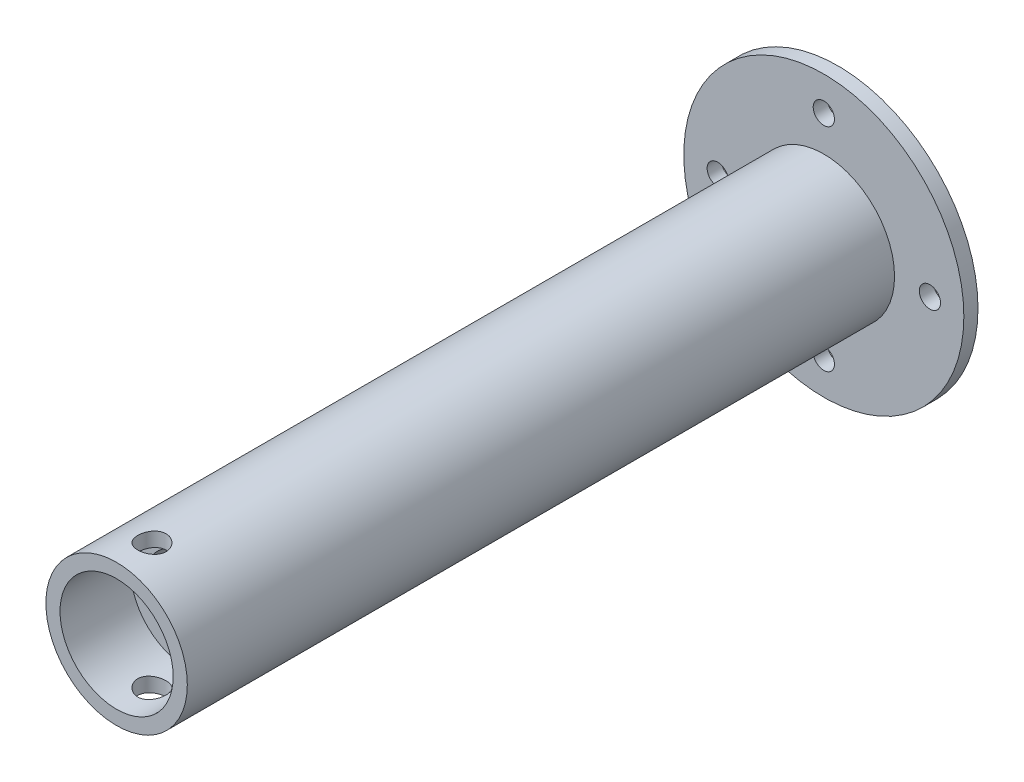
ISO-10303-21;
HEADER;
FILE_DESCRIPTION(('STEP AP214'),'2;1');
FILE_NAME('part.step','',(''),(''),'','','');
FILE_SCHEMA(('AUTOMOTIVE_DESIGN { 1 0 10303 214 1 1 1 1 }'));
ENDSEC;
DATA;
#1=APPLICATION_CONTEXT('core data for automotive mechanical design processes');
#2=APPLICATION_PROTOCOL_DEFINITION('international standard','automotive_design',2000,#1);
#3=PRODUCT_CONTEXT('',#1,'mechanical');
#4=PRODUCT('Part','Part','',(#3));
#5=PRODUCT_RELATED_PRODUCT_CATEGORY('part','',(#4));
#6=PRODUCT_DEFINITION_FORMATION('','',#4);
#7=PRODUCT_DEFINITION_CONTEXT('part definition',#1,'design');
#8=PRODUCT_DEFINITION('design','',#6,#7);
#9=PRODUCT_DEFINITION_SHAPE('','',#8);
#10=(LENGTH_UNIT() NAMED_UNIT(*) SI_UNIT(.MILLI.,.METRE.));
#11=(NAMED_UNIT(*) PLANE_ANGLE_UNIT() SI_UNIT($,.RADIAN.));
#12=(NAMED_UNIT(*) SI_UNIT($,.STERADIAN.) SOLID_ANGLE_UNIT());
#13=UNCERTAINTY_MEASURE_WITH_UNIT(LENGTH_MEASURE(1.E-05),#10,'distance_accuracy_value','');
#14=(GEOMETRIC_REPRESENTATION_CONTEXT(3) GLOBAL_UNCERTAINTY_ASSIGNED_CONTEXT((#13)) GLOBAL_UNIT_ASSIGNED_CONTEXT((#10,
#11,#12)) REPRESENTATION_CONTEXT('',''));
#15=CARTESIAN_POINT('',(0.,0.,0.));
#16=DIRECTION('',(0.,0.,1.));
#17=DIRECTION('',(1.,0.,0.));
#18=AXIS2_PLACEMENT_3D('',#15,#16,#17);
#19=CARTESIAN_POINT('',(0.,0.,-98.));
#20=DIRECTION('',(0.,0.,1.));
#21=DIRECTION('',(1.,0.,0.));
#22=AXIS2_PLACEMENT_3D('',#19,#20,#21);
#23=CYLINDRICAL_SURFACE('',#22,6.);
#24=CARTESIAN_POINT('',(0.,0.,0.));
#25=DIRECTION('',(0.,0.,1.));
#26=DIRECTION('',(1.,0.,0.));
#27=AXIS2_PLACEMENT_3D('',#24,#25,#26);
#28=CIRCLE('',#27,6.);
#29=CARTESIAN_POINT('',(6.,0.,0.));
#30=VERTEX_POINT('',#29);
#31=EDGE_CURVE('E82',#30,#30,#28,.T.);
#32=ORIENTED_EDGE('',*,*,#31,.F.);
#33=EDGE_LOOP('',(#32));
#34=FACE_BOUND('',#33,.T.);
#35=CARTESIAN_POINT('',(0.,0.,92.));
#36=DIRECTION('',(0.,0.,1.));
#37=DIRECTION('',(1.,0.,0.));
#38=AXIS2_PLACEMENT_3D('',#35,#36,#37);
#39=CIRCLE('',#38,6.);
#40=CARTESIAN_POINT('',(6.,0.,92.));
#41=VERTEX_POINT('',#40);
#42=EDGE_CURVE('E79',#41,#41,#39,.F.);
#43=ORIENTED_EDGE('',*,*,#42,.F.);
#44=EDGE_LOOP('',(#43));
#45=FACE_BOUND('',#44,.T.);
#46=ADVANCED_FACE('F37',(#34,#45),#23,.F.);
#47=CARTESIAN_POINT('',(0.,0.,2.));
#48=DIRECTION('',(0.,0.,-1.));
#49=DIRECTION('',(-1.,0.,0.));
#50=AXIS2_PLACEMENT_3D('',#47,#48,#49);
#51=CYLINDRICAL_SURFACE('',#50,19.8);
#52=CARTESIAN_POINT('',(0.,0.,2.));
#53=DIRECTION('',(0.,0.,1.));
#54=DIRECTION('',(1.,0.,0.));
#55=AXIS2_PLACEMENT_3D('',#52,#53,#54);
#56=CIRCLE('',#55,19.8);
#57=CARTESIAN_POINT('',(19.8,0.,2.));
#58=VERTEX_POINT('',#57);
#59=EDGE_CURVE('E10',#58,#58,#56,.T.);
#60=ORIENTED_EDGE('',*,*,#59,.F.);
#61=EDGE_LOOP('',(#60));
#62=FACE_BOUND('',#61,.T.);
#63=CARTESIAN_POINT('',(0.,0.,0.));
#64=DIRECTION('',(0.,0.,1.));
#65=DIRECTION('',(1.,0.,0.));
#66=AXIS2_PLACEMENT_3D('',#63,#64,#65);
#67=CIRCLE('',#66,19.8);
#68=CARTESIAN_POINT('',(19.8,0.,0.));
#69=VERTEX_POINT('',#68);
#70=EDGE_CURVE('E51',#69,#69,#67,.T.);
#71=ORIENTED_EDGE('',*,*,#70,.T.);
#72=EDGE_LOOP('',(#71));
#73=FACE_BOUND('',#72,.T.);
#74=ADVANCED_FACE('F39',(#62,#73),#51,.T.);
#75=CARTESIAN_POINT('',(0.,0.,2.));
#76=DIRECTION('',(0.,0.,1.));
#77=DIRECTION('',(1.,0.,0.));
#78=AXIS2_PLACEMENT_3D('',#75,#76,#77);
#79=PLANE('',#78);
#80=CARTESIAN_POINT('',(0.,0.,2.));
#81=DIRECTION('',(0.,0.,1.));
#82=DIRECTION('',(1.,0.,0.));
#83=AXIS2_PLACEMENT_3D('',#80,#81,#82);
#84=CIRCLE('',#83,10.);
#85=CARTESIAN_POINT('',(10.,0.,2.));
#86=VERTEX_POINT('',#85);
#87=EDGE_CURVE('E180',#86,#86,#84,.T.);
#88=ORIENTED_EDGE('',*,*,#87,.F.);
#89=EDGE_LOOP('',(#88));
#90=FACE_BOUND('',#89,.T.);
#91=CARTESIAN_POINT('',(0.,15.,2.));
#92=DIRECTION('',(0.,0.,1.));
#93=DIRECTION('',(1.,0.,0.));
#94=AXIS2_PLACEMENT_3D('',#91,#92,#93);
#95=CIRCLE('',#94,1.5);
#96=CARTESIAN_POINT('',(1.5,15.,2.));
#97=VERTEX_POINT('',#96);
#98=EDGE_CURVE('E68',#97,#97,#95,.T.);
#99=ORIENTED_EDGE('',*,*,#98,.F.);
#100=EDGE_LOOP('',(#99));
#101=FACE_BOUND('',#100,.T.);
#102=CARTESIAN_POINT('',(15.0000000000004,4.23570186157979E-13,2.));
#103=DIRECTION('',(0.,0.,1.));
#104=DIRECTION('',(1.,0.,0.));
#105=AXIS2_PLACEMENT_3D('',#102,#103,#104);
#106=CIRCLE('',#105,1.50000000000033);
#107=CARTESIAN_POINT('',(16.5000000000008,4.23570186157979E-13,2.));
#108=VERTEX_POINT('',#107);
#109=EDGE_CURVE('E191',#108,#108,#106,.T.);
#110=ORIENTED_EDGE('',*,*,#109,.F.);
#111=EDGE_LOOP('',(#110));
#112=FACE_BOUND('',#111,.T.);
#113=CARTESIAN_POINT('',(8.47140372315957E-13,-15.,2.));
#114=DIRECTION('',(0.,0.,1.));
#115=DIRECTION('',(1.,0.,0.));
#116=AXIS2_PLACEMENT_3D('',#113,#114,#115);
#117=CIRCLE('',#116,1.50000000000091);
#118=CARTESIAN_POINT('',(1.50000000000176,-15.,2.));
#119=VERTEX_POINT('',#118);
#120=EDGE_CURVE('E194',#119,#119,#117,.T.);
#121=ORIENTED_EDGE('',*,*,#120,.F.);
#122=EDGE_LOOP('',(#121));
#123=FACE_BOUND('',#122,.T.);
#124=CARTESIAN_POINT('',(-14.9999999999996,-4.254071563567E-13,2.));
#125=DIRECTION('',(0.,0.,1.));
#126=DIRECTION('',(1.,0.,0.));
#127=AXIS2_PLACEMENT_3D('',#124,#125,#126);
#128=CIRCLE('',#127,1.50000000000068);
#129=CARTESIAN_POINT('',(-13.4999999999989,-4.254071563567E-13,2.));
#130=VERTEX_POINT('',#129);
#131=EDGE_CURVE('E60',#130,#130,#128,.T.);
#132=ORIENTED_EDGE('',*,*,#131,.F.);
#133=EDGE_LOOP('',(#132));
#134=FACE_BOUND('',#133,.T.);
#135=ORIENTED_EDGE('',*,*,#59,.T.);
#136=EDGE_LOOP('',(#135));
#137=FACE_BOUND('',#136,.T.);
#138=ADVANCED_FACE('F142',(#90,#101,#112,#123,#134,#137),#79,.T.);
#139=CARTESIAN_POINT('',(0.,0.,0.));
#140=DIRECTION('',(0.,0.,1.));
#141=DIRECTION('',(1.,0.,0.));
#142=AXIS2_PLACEMENT_3D('',#139,#140,#141);
#143=PLANE('',#142);
#144=ORIENTED_EDGE('',*,*,#31,.T.);
#145=EDGE_LOOP('',(#144));
#146=FACE_BOUND('',#145,.T.);
#147=CARTESIAN_POINT('',(0.,15.,0.));
#148=DIRECTION('',(0.,0.,1.));
#149=DIRECTION('',(1.,0.,0.));
#150=AXIS2_PLACEMENT_3D('',#147,#148,#149);
#151=CIRCLE('',#150,1.5);
#152=CARTESIAN_POINT('',(1.5,15.,0.));
#153=VERTEX_POINT('',#152);
#154=EDGE_CURVE('E57',#153,#153,#151,.T.);
#155=ORIENTED_EDGE('',*,*,#154,.T.);
#156=EDGE_LOOP('',(#155));
#157=FACE_BOUND('',#156,.T.);
#158=CARTESIAN_POINT('',(15.0000000000004,4.23570186157979E-13,0.));
#159=DIRECTION('',(0.,0.,1.));
#160=DIRECTION('',(1.,0.,0.));
#161=AXIS2_PLACEMENT_3D('',#158,#159,#160);
#162=CIRCLE('',#161,1.50000000000033);
#163=CARTESIAN_POINT('',(16.5000000000008,4.23570186157979E-13,0.));
#164=VERTEX_POINT('',#163);
#165=EDGE_CURVE('E72',#164,#164,#162,.T.);
#166=ORIENTED_EDGE('',*,*,#165,.T.);
#167=EDGE_LOOP('',(#166));
#168=FACE_BOUND('',#167,.T.);
#169=CARTESIAN_POINT('',(8.47140372315957E-13,-15.,0.));
#170=DIRECTION('',(0.,0.,1.));
#171=DIRECTION('',(1.,0.,0.));
#172=AXIS2_PLACEMENT_3D('',#169,#170,#171);
#173=CIRCLE('',#172,1.50000000000091);
#174=CARTESIAN_POINT('',(1.50000000000176,-15.,0.));
#175=VERTEX_POINT('',#174);
#176=EDGE_CURVE('E67',#175,#175,#173,.T.);
#177=ORIENTED_EDGE('',*,*,#176,.T.);
#178=EDGE_LOOP('',(#177));
#179=FACE_BOUND('',#178,.T.);
#180=CARTESIAN_POINT('',(-14.9999999999996,-4.254071563567E-13,0.));
#181=DIRECTION('',(0.,0.,1.));
#182=DIRECTION('',(1.,0.,0.));
#183=AXIS2_PLACEMENT_3D('',#180,#181,#182);
#184=CIRCLE('',#183,1.50000000000068);
#185=CARTESIAN_POINT('',(-13.4999999999989,-4.254071563567E-13,0.));
#186=VERTEX_POINT('',#185);
#187=EDGE_CURVE('E63',#186,#186,#184,.T.);
#188=ORIENTED_EDGE('',*,*,#187,.T.);
#189=EDGE_LOOP('',(#188));
#190=FACE_BOUND('',#189,.T.);
#191=ORIENTED_EDGE('',*,*,#70,.F.);
#192=EDGE_LOOP('',(#191));
#193=FACE_BOUND('',#192,.T.);
#194=ADVANCED_FACE('F140',(#146,#157,#168,#179,#190,#193),#143,.F.);
#195=CARTESIAN_POINT('',(-14.9999999999996,-4.254071563567E-13,-3.));
#196=DIRECTION('',(0.,0.,1.));
#197=DIRECTION('',(1.,0.,0.));
#198=AXIS2_PLACEMENT_3D('',#195,#196,#197);
#199=CYLINDRICAL_SURFACE('',#198,1.50000000000068);
#200=ORIENTED_EDGE('',*,*,#131,.T.);
#201=EDGE_LOOP('',(#200));
#202=FACE_BOUND('',#201,.T.);
#203=ORIENTED_EDGE('',*,*,#187,.F.);
#204=EDGE_LOOP('',(#203));
#205=FACE_BOUND('',#204,.T.);
#206=ADVANCED_FACE('F136',(#202,#205),#199,.F.);
#207=CARTESIAN_POINT('',(8.47140372315957E-13,-15.,-3.));
#208=DIRECTION('',(0.,0.,1.));
#209=DIRECTION('',(1.,0.,0.));
#210=AXIS2_PLACEMENT_3D('',#207,#208,#209);
#211=CYLINDRICAL_SURFACE('',#210,1.50000000000091);
#212=ORIENTED_EDGE('',*,*,#120,.T.);
#213=EDGE_LOOP('',(#212));
#214=FACE_BOUND('',#213,.T.);
#215=ORIENTED_EDGE('',*,*,#176,.F.);
#216=EDGE_LOOP('',(#215));
#217=FACE_BOUND('',#216,.T.);
#218=ADVANCED_FACE('F132',(#214,#217),#211,.F.);
#219=CARTESIAN_POINT('',(15.0000000000004,4.23570186157979E-13,-3.));
#220=DIRECTION('',(0.,0.,1.));
#221=DIRECTION('',(1.,0.,0.));
#222=AXIS2_PLACEMENT_3D('',#219,#220,#221);
#223=CYLINDRICAL_SURFACE('',#222,1.50000000000033);
#224=ORIENTED_EDGE('',*,*,#109,.T.);
#225=EDGE_LOOP('',(#224));
#226=FACE_BOUND('',#225,.T.);
#227=ORIENTED_EDGE('',*,*,#165,.F.);
#228=EDGE_LOOP('',(#227));
#229=FACE_BOUND('',#228,.T.);
#230=ADVANCED_FACE('F128',(#226,#229),#223,.F.);
#231=CARTESIAN_POINT('',(0.,15.,-3.));
#232=DIRECTION('',(0.,0.,1.));
#233=DIRECTION('',(1.,0.,0.));
#234=AXIS2_PLACEMENT_3D('',#231,#232,#233);
#235=CYLINDRICAL_SURFACE('',#234,1.5);
#236=ORIENTED_EDGE('',*,*,#98,.T.);
#237=EDGE_LOOP('',(#236));
#238=FACE_BOUND('',#237,.T.);
#239=ORIENTED_EDGE('',*,*,#154,.F.);
#240=EDGE_LOOP('',(#239));
#241=FACE_BOUND('',#240,.T.);
#242=ADVANCED_FACE('F123',(#238,#241),#235,.F.);
#243=CARTESIAN_POINT('',(0.,0.,102.));
#244=DIRECTION('',(0.,0.,-1.));
#245=DIRECTION('',(-1.,0.,0.));
#246=AXIS2_PLACEMENT_3D('',#243,#244,#245);
#247=CYLINDRICAL_SURFACE('',#246,10.);
#248=CARTESIAN_POINT('',(0.,-10.,99.));
#249=CARTESIAN_POINT('',(0.111153813585267,-9.99999795161742,98.9999959110033));
#250=CARTESIAN_POINT('',(0.222359320403045,-9.99812770356462,98.9907023140647));
#251=CARTESIAN_POINT('',(0.441627015378038,-9.99084731246463,98.9538029997695));
#252=CARTESIAN_POINT('',(0.54968663508271,-9.98543435720372,98.926182734397));
#253=CARTESIAN_POINT('',(0.759460610526623,-9.97167298556573,98.8535174527584));
#254=CARTESIAN_POINT('',(0.861180935866266,-9.96332738153436,98.8084891263106));
#255=CARTESIAN_POINT('',(1.05561597772845,-9.94460796070629,98.7023355049774));
#256=CARTESIAN_POINT('',(1.14833123015162,-9.93423426471414,98.6412111687856));
#257=CARTESIAN_POINT('',(1.32338695462973,-9.9124433065994,98.5037230114171));
#258=CARTESIAN_POINT('',(1.40558790231705,-9.90101491008695,98.4271832892176));
#259=CARTESIAN_POINT('',(1.55607351321606,-9.87848360905176,98.2614151672166));
#260=CARTESIAN_POINT('',(1.62435708954085,-9.86738073000847,98.1721857773298));
#261=CARTESIAN_POINT('',(1.74566350669524,-9.8466488362523,97.9825676139763));
#262=CARTESIAN_POINT('',(1.79854187773173,-9.83703414729892,97.8820847124073));
#263=CARTESIAN_POINT('',(1.88661133316061,-9.82052536116836,97.6734363619918));
#264=CARTESIAN_POINT('',(1.92180416487448,-9.81363099523923,97.5652716733073));
#265=CARTESIAN_POINT('',(1.97305059976965,-9.80345610504409,97.3458312721842));
#266=CARTESIAN_POINT('',(1.98934899591755,-9.80012940214375,97.2346149117156));
#267=CARTESIAN_POINT('',(2.00310425545224,-9.79732750121254,97.0109803572713));
#268=CARTESIAN_POINT('',(2.000563045427,-9.79785190935681,96.8985622873597));
#269=CARTESIAN_POINT('',(1.97690914620364,-9.80265102296369,96.677506423958));
#270=CARTESIAN_POINT('',(1.95607708048781,-9.80686905717527,96.5688371887454));
#271=CARTESIAN_POINT('',(1.8968757692461,-9.81849092320002,96.356567846674));
#272=CARTESIAN_POINT('',(1.85850568620136,-9.82589490715558,96.252967982162));
#273=CARTESIAN_POINT('',(1.76504956734944,-9.84311237000816,96.0529694765928));
#274=CARTESIAN_POINT('',(1.70985230246424,-9.85294179627409,95.9566242408617));
#275=CARTESIAN_POINT('',(1.58438714914537,-9.87389237546124,95.7744583000544));
#276=CARTESIAN_POINT('',(1.51411752871366,-9.88501367676732,95.6886388062977));
#277=CARTESIAN_POINT('',(1.35899986912118,-9.90754042482924,95.5283411950861));
#278=CARTESIAN_POINT('',(1.2739123224249,-9.91894738421809,95.4540948642817));
#279=CARTESIAN_POINT('',(1.09237004812403,-9.94057697428817,95.3208923073976));
#280=CARTESIAN_POINT('',(0.995915174758785,-9.95079958977947,95.2619362774128));
#281=CARTESIAN_POINT('',(0.794118773757845,-9.96893380321774,95.1609449815481));
#282=CARTESIAN_POINT('',(0.688763639170602,-9.97684177696544,95.1189362127109));
#283=CARTESIAN_POINT('',(0.47229795289733,-9.98942817975716,95.0532790519229));
#284=CARTESIAN_POINT('',(0.361188100144899,-9.99410700001063,95.0296284358527));
#285=CARTESIAN_POINT('',(0.138358811254301,-9.99965343733736,95.0016870924114));
#286=CARTESIAN_POINT('',(0.0266806566511534,-10.0005834930494,94.9970791609195));
#287=CARTESIAN_POINT('',(-0.195849868385425,-9.99870103860205,95.0064997178844));
#288=CARTESIAN_POINT('',(-0.306702284887582,-9.99588873882892,95.0205271587052));
#289=CARTESIAN_POINT('',(-0.523411319893078,-9.98687664016035,95.0665567470879));
#290=CARTESIAN_POINT('',(-0.629303896679805,-9.98070752808413,95.0983961369958));
#291=CARTESIAN_POINT('',(-0.834247254999333,-9.96567104122065,95.1789679653116));
#292=CARTESIAN_POINT('',(-0.933297523275077,-9.95680346428454,95.2277016693537));
#293=CARTESIAN_POINT('',(-1.12308234737243,-9.93719823066589,95.3413649813026));
#294=CARTESIAN_POINT('',(-1.21370025350437,-9.92643900874103,95.4064855620779));
#295=CARTESIAN_POINT('',(-1.38283603823841,-9.90429469659765,95.5508183824146));
#296=CARTESIAN_POINT('',(-1.46135261786152,-9.89290953936776,95.6300321327997));
#297=CARTESIAN_POINT('',(-1.60528118154835,-9.8705860711393,95.8017467037822));
#298=CARTESIAN_POINT('',(-1.6704754048973,-9.85965720466609,95.8944314884427));
#299=CARTESIAN_POINT('',(-1.78437084010241,-9.83968383592389,96.0896227227134));
#300=CARTESIAN_POINT('',(-1.8330727118458,-9.83063925826685,96.1921287791471));
#301=CARTESIAN_POINT('',(-1.91230368316392,-9.81553481168766,96.4035364922991));
#302=CARTESIAN_POINT('',(-1.9429269995821,-9.80945949744373,96.5124016824206));
#303=CARTESIAN_POINT('',(-1.98541730325439,-9.8009487358405,96.7338669069818));
#304=CARTESIAN_POINT('',(-1.99728673645022,-9.79851281382223,96.8464664524187));
#305=CARTESIAN_POINT('',(-2.00184182173494,-9.79758299262758,97.0700177290886));
#306=CARTESIAN_POINT('',(-1.99487157614179,-9.79901838378602,97.180962297854));
#307=CARTESIAN_POINT('',(-1.96270460820012,-9.80551146969228,97.40006329981));
#308=CARTESIAN_POINT('',(-1.9375080322586,-9.81056913534338,97.5082197553896));
#309=CARTESIAN_POINT('',(-1.86975713699791,-9.82370528438317,97.7184554224811));
#310=CARTESIAN_POINT('',(-1.82724501343469,-9.83177642037661,97.8205487210048));
#311=CARTESIAN_POINT('',(-1.72610928920321,-9.8500342994834,98.0162074414689));
#312=CARTESIAN_POINT('',(-1.66748433754977,-9.86022121997788,98.1097721474503));
#313=CARTESIAN_POINT('',(-1.53461182957283,-9.88177921046451,98.2874311443006));
#314=CARTESIAN_POINT('',(-1.46011577447036,-9.89316745819399,98.3713375305352));
#315=CARTESIAN_POINT('',(-1.29812873802628,-9.91572163743909,98.5255724110583));
#316=CARTESIAN_POINT('',(-1.21063477430668,-9.92688751726369,98.5958977806345));
#317=CARTESIAN_POINT('',(-1.0240352581765,-9.94787664775943,98.7216692878929));
#318=CARTESIAN_POINT('',(-0.924817768859674,-9.95768462438492,98.7769520065601));
#319=CARTESIAN_POINT('',(-0.718332721881471,-9.9747025017,98.8699722451932));
#320=CARTESIAN_POINT('',(-0.611072521726261,-9.98191474277232,98.907725579065));
#321=CARTESIAN_POINT('',(-0.419642977847568,-9.99152745190741,98.9573038960894));
#322=CARTESIAN_POINT('',(-0.336563328027576,-9.99468606316904,98.9732863874155));
#323=CARTESIAN_POINT('',(-0.168999050420137,-9.99892308279786,98.9946358247167));
#324=CARTESIAN_POINT('',(-0.0845144674972395,-10.0000015574631,99.0000031090195));
#325=CARTESIAN_POINT('',(0.,-10.,99.));
#326=B_SPLINE_CURVE_WITH_KNOTS('',3,(#248,#249,#250,#251,#252,#253,#254,#255,#256,#257,#258,
#259,#260,#261,#262,#263,#264,#265,#266,#267,#268,#269,#270,#271,#272,#273,#274,#275,#276,#277,
#278,#279,#280,#281,#282,#283,#284,#285,#286,#287,#288,#289,#290,#291,#292,#293,#294,#295,#296,
#297,#298,#299,#300,#301,#302,#303,#304,#305,#306,#307,#308,#309,#310,#311,#312,#313,#314,#315,
#316,#317,#318,#319,#320,#321,#322,#323,#324,#325),.UNSPECIFIED.,.T.,.F.,(4,2,2,2,2,2,2,2,2,2,2,
2,2,2,2,2,2,2,2,2,2,2,2,2,2,2,2,2,2,2,2,2,2,2,2,2,2,2,4),(0.,0.333152261322518,
0.666569301382644,0.999667470500677,1.33274580446172,1.66986534022438,2.00701119349472,
2.34722390011845,2.68740298730395,3.02312370207173,3.35881008562449,3.68943454012557,
4.02007478507459,4.35294980407184,4.6858630949934,5.024765049827,5.3636713507964,
5.70310549708048,6.04249851396072,6.3762147135253,6.70991215315735,7.04060907901446,
7.37133078432045,7.70610132066717,8.0409077669186,8.38081257158451,8.72070377446933,
9.05880762065445,9.39686736660829,9.72879445135401,10.0607188698522,10.3918392250622,
10.7229873516373,11.0597615247829,11.3966130906586,11.7369899335127,12.0770591103504,
12.3303755057979,12.5836838274199),.UNSPECIFIED.);
#327=CARTESIAN_POINT('',(0.,-10.,99.));
#328=VERTEX_POINT('',#327);
#329=EDGE_CURVE('E112',#328,#328,#326,.T.);
#330=ORIENTED_EDGE('',*,*,#329,.T.);
#331=EDGE_LOOP('',(#330));
#332=FACE_BOUND('',#331,.T.);
#333=CARTESIAN_POINT('',(0.,10.,99.));
#334=CARTESIAN_POINT('',(-0.111153813585267,9.99999795161742,98.9999959110033));
#335=CARTESIAN_POINT('',(-0.222359320403045,9.99812770356462,98.9907023140647));
#336=CARTESIAN_POINT('',(-0.441627015378038,9.99084731246463,98.9538029997695));
#337=CARTESIAN_POINT('',(-0.54968663508271,9.98543435720372,98.926182734397));
#338=CARTESIAN_POINT('',(-0.759460610526623,9.97167298556573,98.8535174527584));
#339=CARTESIAN_POINT('',(-0.861180935866266,9.96332738153436,98.8084891263106));
#340=CARTESIAN_POINT('',(-1.05561597772845,9.94460796070629,98.7023355049774));
#341=CARTESIAN_POINT('',(-1.14833123015162,9.93423426471414,98.6412111687856));
#342=CARTESIAN_POINT('',(-1.32338695462973,9.9124433065994,98.5037230114171));
#343=CARTESIAN_POINT('',(-1.40558790231705,9.90101491008695,98.4271832892176));
#344=CARTESIAN_POINT('',(-1.55607351321606,9.87848360905176,98.2614151672166));
#345=CARTESIAN_POINT('',(-1.62435708954085,9.86738073000847,98.1721857773298));
#346=CARTESIAN_POINT('',(-1.74566350669524,9.8466488362523,97.9825676139763));
#347=CARTESIAN_POINT('',(-1.79854187773173,9.83703414729892,97.8820847124073));
#348=CARTESIAN_POINT('',(-1.88661133316061,9.82052536116836,97.6734363619918));
#349=CARTESIAN_POINT('',(-1.92180416487448,9.81363099523923,97.5652716733073));
#350=CARTESIAN_POINT('',(-1.97305059976965,9.80345610504409,97.3458312721842));
#351=CARTESIAN_POINT('',(-1.98934899591755,9.80012940214375,97.2346149117156));
#352=CARTESIAN_POINT('',(-2.00310425545224,9.79732750121254,97.0109803572713));
#353=CARTESIAN_POINT('',(-2.000563045427,9.79785190935681,96.8985622873597));
#354=CARTESIAN_POINT('',(-1.97690914620364,9.80265102296369,96.677506423958));
#355=CARTESIAN_POINT('',(-1.95607708048781,9.80686905717527,96.5688371887454));
#356=CARTESIAN_POINT('',(-1.8968757692461,9.81849092320002,96.356567846674));
#357=CARTESIAN_POINT('',(-1.85850568620136,9.82589490715558,96.252967982162));
#358=CARTESIAN_POINT('',(-1.76504956734944,9.84311237000816,96.0529694765928));
#359=CARTESIAN_POINT('',(-1.70985230246424,9.85294179627409,95.9566242408617));
#360=CARTESIAN_POINT('',(-1.58438714914537,9.87389237546124,95.7744583000544));
#361=CARTESIAN_POINT('',(-1.51411752871366,9.88501367676732,95.6886388062977));
#362=CARTESIAN_POINT('',(-1.35899986912118,9.90754042482924,95.5283411950861));
#363=CARTESIAN_POINT('',(-1.2739123224249,9.91894738421809,95.4540948642817));
#364=CARTESIAN_POINT('',(-1.09237004812403,9.94057697428817,95.3208923073976));
#365=CARTESIAN_POINT('',(-0.995915174758785,9.95079958977947,95.2619362774128));
#366=CARTESIAN_POINT('',(-0.794118773757845,9.96893380321774,95.1609449815481));
#367=CARTESIAN_POINT('',(-0.688763639170602,9.97684177696544,95.1189362127109));
#368=CARTESIAN_POINT('',(-0.47229795289733,9.98942817975716,95.0532790519229));
#369=CARTESIAN_POINT('',(-0.361188100144899,9.99410700001063,95.0296284358527));
#370=CARTESIAN_POINT('',(-0.138358811254301,9.99965343733736,95.0016870924114));
#371=CARTESIAN_POINT('',(-0.0266806566511534,10.0005834930494,94.9970791609195));
#372=CARTESIAN_POINT('',(0.195849868385425,9.99870103860205,95.0064997178844));
#373=CARTESIAN_POINT('',(0.306702284887582,9.99588873882892,95.0205271587052));
#374=CARTESIAN_POINT('',(0.523411319893078,9.98687664016035,95.0665567470879));
#375=CARTESIAN_POINT('',(0.629303896679805,9.98070752808413,95.0983961369958));
#376=CARTESIAN_POINT('',(0.834247254999333,9.96567104122065,95.1789679653116));
#377=CARTESIAN_POINT('',(0.933297523275077,9.95680346428454,95.2277016693537));
#378=CARTESIAN_POINT('',(1.12308234737243,9.93719823066589,95.3413649813026));
#379=CARTESIAN_POINT('',(1.21370025350437,9.92643900874103,95.4064855620779));
#380=CARTESIAN_POINT('',(1.38283603823841,9.90429469659765,95.5508183824146));
#381=CARTESIAN_POINT('',(1.46135261786152,9.89290953936776,95.6300321327997));
#382=CARTESIAN_POINT('',(1.60528118154835,9.8705860711393,95.8017467037822));
#383=CARTESIAN_POINT('',(1.6704754048973,9.85965720466609,95.8944314884427));
#384=CARTESIAN_POINT('',(1.78437084010241,9.83968383592389,96.0896227227134));
#385=CARTESIAN_POINT('',(1.8330727118458,9.83063925826685,96.1921287791471));
#386=CARTESIAN_POINT('',(1.91230368316392,9.81553481168766,96.4035364922991));
#387=CARTESIAN_POINT('',(1.9429269995821,9.80945949744373,96.5124016824206));
#388=CARTESIAN_POINT('',(1.98541730325439,9.8009487358405,96.7338669069818));
#389=CARTESIAN_POINT('',(1.99728673645022,9.79851281382223,96.8464664524187));
#390=CARTESIAN_POINT('',(2.00184182173494,9.79758299262758,97.0700177290886));
#391=CARTESIAN_POINT('',(1.99487157614179,9.79901838378602,97.180962297854));
#392=CARTESIAN_POINT('',(1.96270460820012,9.80551146969228,97.40006329981));
#393=CARTESIAN_POINT('',(1.9375080322586,9.81056913534338,97.5082197553896));
#394=CARTESIAN_POINT('',(1.86975713699791,9.82370528438317,97.7184554224811));
#395=CARTESIAN_POINT('',(1.82724501343469,9.83177642037661,97.8205487210048));
#396=CARTESIAN_POINT('',(1.72610928920321,9.8500342994834,98.0162074414689));
#397=CARTESIAN_POINT('',(1.66748433754977,9.86022121997788,98.1097721474503));
#398=CARTESIAN_POINT('',(1.53461182957283,9.88177921046451,98.2874311443006));
#399=CARTESIAN_POINT('',(1.46011577447036,9.89316745819399,98.3713375305352));
#400=CARTESIAN_POINT('',(1.29812873802628,9.91572163743909,98.5255724110583));
#401=CARTESIAN_POINT('',(1.21063477430668,9.92688751726369,98.5958977806345));
#402=CARTESIAN_POINT('',(1.0240352581765,9.94787664775943,98.7216692878929));
#403=CARTESIAN_POINT('',(0.924817768859674,9.95768462438492,98.7769520065601));
#404=CARTESIAN_POINT('',(0.718332721881471,9.9747025017,98.8699722451932));
#405=CARTESIAN_POINT('',(0.611072521726261,9.98191474277232,98.907725579065));
#406=CARTESIAN_POINT('',(0.419642977847568,9.99152745190741,98.9573038960894));
#407=CARTESIAN_POINT('',(0.336563328027576,9.99468606316904,98.9732863874155));
#408=CARTESIAN_POINT('',(0.168999050420137,9.99892308279786,98.9946358247167));
#409=CARTESIAN_POINT('',(0.0845144674972395,10.0000015574631,99.0000031090195));
#410=CARTESIAN_POINT('',(0.,10.,99.));
#411=B_SPLINE_CURVE_WITH_KNOTS('',3,(#333,#334,#335,#336,#337,#338,#339,#340,#341,#342,#343,
#344,#345,#346,#347,#348,#349,#350,#351,#352,#353,#354,#355,#356,#357,#358,#359,#360,#361,#362,
#363,#364,#365,#366,#367,#368,#369,#370,#371,#372,#373,#374,#375,#376,#377,#378,#379,#380,#381,
#382,#383,#384,#385,#386,#387,#388,#389,#390,#391,#392,#393,#394,#395,#396,#397,#398,#399,#400,
#401,#402,#403,#404,#405,#406,#407,#408,#409,#410),.UNSPECIFIED.,.T.,.F.,(4,2,2,2,2,2,2,2,2,2,2,
2,2,2,2,2,2,2,2,2,2,2,2,2,2,2,2,2,2,2,2,2,2,2,2,2,2,2,4),(0.,0.333152261322518,
0.666569301382644,0.999667470500677,1.33274580446172,1.66986534022438,2.00701119349472,
2.34722390011845,2.68740298730395,3.02312370207173,3.35881008562449,3.68943454012557,
4.02007478507459,4.35294980407184,4.6858630949934,5.024765049827,5.3636713507964,
5.70310549708048,6.04249851396072,6.3762147135253,6.70991215315735,7.04060907901446,
7.37133078432045,7.70610132066717,8.0409077669186,8.38081257158451,8.72070377446933,
9.05880762065445,9.39686736660829,9.72879445135401,10.0607188698522,10.3918392250622,
10.7229873516373,11.0597615247829,11.3966130906586,11.7369899335127,12.0770591103504,
12.3303755057979,12.5836838274199),.UNSPECIFIED.);
#412=CARTESIAN_POINT('',(0.,10.,99.));
#413=VERTEX_POINT('',#412);
#414=EDGE_CURVE('E105',#413,#413,#411,.T.);
#415=ORIENTED_EDGE('',*,*,#414,.T.);
#416=EDGE_LOOP('',(#415));
#417=FACE_BOUND('',#416,.T.);
#418=CARTESIAN_POINT('',(0.,0.,102.));
#419=DIRECTION('',(0.,0.,1.));
#420=DIRECTION('',(1.,0.,0.));
#421=AXIS2_PLACEMENT_3D('',#418,#419,#420);
#422=CIRCLE('',#421,10.);
#423=CARTESIAN_POINT('',(10.,0.,102.));
#424=VERTEX_POINT('',#423);
#425=EDGE_CURVE('E181',#424,#424,#422,.T.);
#426=ORIENTED_EDGE('',*,*,#425,.F.);
#427=EDGE_LOOP('',(#426));
#428=FACE_BOUND('',#427,.T.);
#429=ORIENTED_EDGE('',*,*,#87,.T.);
#430=EDGE_LOOP('',(#429));
#431=FACE_BOUND('',#430,.T.);
#432=ADVANCED_FACE('F117',(#332,#417,#428,#431),#247,.T.);
#433=CARTESIAN_POINT('',(0.,0.,102.));
#434=DIRECTION('',(0.,0.,1.));
#435=DIRECTION('',(1.,0.,0.));
#436=AXIS2_PLACEMENT_3D('',#433,#434,#435);
#437=PLANE('',#436);
#438=CARTESIAN_POINT('',(0.,0.,102.));
#439=DIRECTION('',(0.,0.,1.));
#440=DIRECTION('',(1.,0.,0.));
#441=AXIS2_PLACEMENT_3D('',#438,#439,#440);
#442=CIRCLE('',#441,8.);
#443=CARTESIAN_POINT('',(8.,0.,102.));
#444=VERTEX_POINT('',#443);
#445=EDGE_CURVE('E173',#444,#444,#442,.T.);
#446=ORIENTED_EDGE('',*,*,#445,.F.);
#447=EDGE_LOOP('',(#446));
#448=FACE_BOUND('',#447,.T.);
#449=ORIENTED_EDGE('',*,*,#425,.T.);
#450=EDGE_LOOP('',(#449));
#451=FACE_BOUND('',#450,.T.);
#452=ADVANCED_FACE('F122',(#448,#451),#437,.T.);
#453=CARTESIAN_POINT('',(0.,0.,92.));
#454=DIRECTION('',(0.,0.,1.));
#455=DIRECTION('',(1.,0.,0.));
#456=AXIS2_PLACEMENT_3D('',#453,#454,#455);
#457=PLANE('',#456);
#458=CARTESIAN_POINT('',(0.,0.,92.));
#459=DIRECTION('',(0.,0.,1.));
#460=DIRECTION('',(1.,0.,0.));
#461=AXIS2_PLACEMENT_3D('',#458,#459,#460);
#462=CIRCLE('',#461,8.);
#463=CARTESIAN_POINT('',(8.,0.,92.));
#464=VERTEX_POINT('',#463);
#465=EDGE_CURVE('E83',#464,#464,#462,.T.);
#466=ORIENTED_EDGE('',*,*,#465,.T.);
#467=EDGE_LOOP('',(#466));
#468=FACE_BOUND('',#467,.T.);
#469=ORIENTED_EDGE('',*,*,#42,.T.);
#470=EDGE_LOOP('',(#469));
#471=FACE_BOUND('',#470,.T.);
#472=ADVANCED_FACE('F99',(#468,#471),#457,.T.);
#473=CARTESIAN_POINT('',(0.,0.,92.));
#474=DIRECTION('',(0.,0.,1.));
#475=DIRECTION('',(1.,0.,0.));
#476=AXIS2_PLACEMENT_3D('',#473,#474,#475);
#477=CYLINDRICAL_SURFACE('',#476,8.);
#478=CARTESIAN_POINT('',(0.,-8.,99.));
#479=CARTESIAN_POINT('',(-0.110501451559641,-7.9999981315735,98.9999968990158));
#480=CARTESIAN_POINT('',(-0.221037543774351,-7.99768770842435,98.990811265635));
#481=CARTESIAN_POINT('',(-0.438941765027376,-7.98869485106526,98.954366464924));
#482=CARTESIAN_POINT('',(-0.546308062494317,-7.98200993893301,98.9270970539495));
#483=CARTESIAN_POINT('',(-0.754694496243435,-7.96500835109376,98.8554143287172));
#484=CARTESIAN_POINT('',(-0.855722084573338,-7.95469603789411,98.811021601713));
#485=CARTESIAN_POINT('',(-1.04889617587257,-7.93153791743495,98.7064248132735));
#486=CARTESIAN_POINT('',(-1.14104237913168,-7.91869202472209,98.646220218508));
#487=CARTESIAN_POINT('',(-1.31573590306788,-7.89156551455591,98.5103989471278));
#488=CARTESIAN_POINT('',(-1.39807425341473,-7.87726276197502,98.4345179000546));
#489=CARTESIAN_POINT('',(-1.54899856960442,-7.84898160157249,98.270063726788));
#490=CARTESIAN_POINT('',(-1.61758298259891,-7.83500323053157,98.1814891694041));
#491=CARTESIAN_POINT('',(-1.74003539039862,-7.80873034264225,97.992539697684));
#492=CARTESIAN_POINT('',(-1.79366962123351,-7.79646392619748,97.8920090255884));
#493=CARTESIAN_POINT('',(-1.88319587806765,-7.77532659757355,97.6830021177866));
#494=CARTESIAN_POINT('',(-1.91909074058685,-7.76645514259225,97.5745271555573));
#495=CARTESIAN_POINT('',(-1.97140644907302,-7.7533396892843,97.3550086690645));
#496=CARTESIAN_POINT('',(-1.98820302444274,-7.74900654662681,97.244060138616));
#497=CARTESIAN_POINT('',(-2.00301570008854,-7.74519149946122,97.0208419080009));
#498=CARTESIAN_POINT('',(-2.00103485575748,-7.74570880570571,96.9085724257438));
#499=CARTESIAN_POINT('',(-1.97864869951961,-7.75145607355756,96.6887789230062));
#500=CARTESIAN_POINT('',(-1.95869112025418,-7.75657150676392,96.5812058380462));
#501=CARTESIAN_POINT('',(-1.90163224920399,-7.77075612894759,96.3709852654519));
#502=CARTESIAN_POINT('',(-1.86452973609252,-7.77982559958985,96.2683381292948));
#503=CARTESIAN_POINT('',(-1.77385263724958,-7.80100151874212,96.0696826449972));
#504=CARTESIAN_POINT('',(-1.72011555631056,-7.81313769959755,95.9737517709472));
#505=CARTESIAN_POINT('',(-1.59780836801993,-7.83906281127988,95.7921083869909));
#506=CARTESIAN_POINT('',(-1.52923566507845,-7.85285203112837,95.7063976692437));
#507=CARTESIAN_POINT('',(-1.37688456624163,-7.88101174053188,95.5450618457408));
#508=CARTESIAN_POINT('',(-1.29272834422115,-7.89538759304001,95.4697940132515));
#509=CARTESIAN_POINT('',(-1.11281589000494,-7.92274620771675,95.3343716767148));
#510=CARTESIAN_POINT('',(-1.0170593036106,-7.93572892732543,95.2742176343152));
#511=CARTESIAN_POINT('',(-0.816154518241861,-7.9589030945892,95.1705992183675));
#512=CARTESIAN_POINT('',(-0.710975190944834,-7.96908480170303,95.1271928796608));
#513=CARTESIAN_POINT('',(-0.49450134419051,-7.98543889321888,95.0587769257206));
#514=CARTESIAN_POINT('',(-0.383207998867311,-7.99161204452374,95.0337637914425));
#515=CARTESIAN_POINT('',(-0.160719960520033,-7.999139990285,95.0033899125882));
#516=CARTESIAN_POINT('',(-0.0495956266509443,-8.00061404677705,94.9975426318996));
#517=CARTESIAN_POINT('',(0.172043833068678,-7.99891739752601,95.0043320027407));
#518=CARTESIAN_POINT('',(0.282559012859459,-7.99574710989128,95.0169669903989));
#519=CARTESIAN_POINT('',(0.498152358368654,-7.98519441503143,95.0599612111885));
#520=CARTESIAN_POINT('',(0.603286825291672,-7.97787512247748,95.0900550179693));
#521=CARTESIAN_POINT('',(0.807009723270014,-7.95984942178845,95.1668094453713));
#522=CARTESIAN_POINT('',(0.905597492043511,-7.94914267159856,95.2134717390842));
#523=CARTESIAN_POINT('',(1.09536417923979,-7.92524410568414,95.3229815051663));
#524=CARTESIAN_POINT('',(1.18638058911444,-7.91201156489243,95.3861014831957));
#525=CARTESIAN_POINT('',(1.35670215152433,-7.88459345583226,95.5263865450626));
#526=CARTESIAN_POINT('',(1.43600527863068,-7.87040772335606,95.6035540528225));
#527=CARTESIAN_POINT('',(1.58265409076364,-7.84225275947695,95.7720026144593));
#528=CARTESIAN_POINT('',(1.64965849016271,-7.82829738916375,95.8635836040032));
#529=CARTESIAN_POINT('',(1.76734767868359,-7.80257171169652,96.0569768459543));
#530=CARTESIAN_POINT('',(1.81803319221058,-7.79080130756035,96.1587886439463));
#531=CARTESIAN_POINT('',(1.90126856081239,-7.77090792979553,96.3692076298841));
#532=CARTESIAN_POINT('',(1.93392586220542,-7.76276340389208,96.4777701711253));
#533=CARTESIAN_POINT('',(1.98046087993837,-7.75102325453578,96.6990795171855));
#534=CARTESIAN_POINT('',(1.99434270330488,-7.74742663626581,96.8118254013767));
#535=CARTESIAN_POINT('',(2.00271812044533,-7.74526534938609,97.034828031807));
#536=CARTESIAN_POINT('',(1.99775719704016,-7.74655910304351,97.145063246833));
#537=CARTESIAN_POINT('',(1.96983637108382,-7.7537054534379,97.3630718515573));
#538=CARTESIAN_POINT('',(1.94687683024903,-7.75955795855809,97.4708452906849));
#539=CARTESIAN_POINT('',(1.88390842592373,-7.77508347576963,97.6802779454205));
#540=CARTESIAN_POINT('',(1.84400187290717,-7.78473353648412,97.7819697403203));
#541=CARTESIAN_POINT('',(1.7483532181401,-7.80677007633104,97.9772871769516));
#542=CARTESIAN_POINT('',(1.69260892004559,-7.81915693494364,98.0709116975825));
#543=CARTESIAN_POINT('',(1.56515699818286,-7.84567512351349,98.2500728386694));
#544=CARTESIAN_POINT('',(1.49307088388302,-7.85984353109009,98.3353347645653));
#545=CARTESIAN_POINT('',(1.33571916158632,-7.88810702995048,98.4927293930605));
#546=CARTESIAN_POINT('',(1.2504504283482,-7.90220210302746,98.564858973484));
#547=CARTESIAN_POINT('',(1.06729011560345,-7.92903540863551,98.6952150780862));
#548=CARTESIAN_POINT('',(0.969197896421851,-7.94174444487824,98.7531661515621));
#549=CARTESIAN_POINT('',(0.764354746013971,-7.96406566633491,98.8516632839207));
#550=CARTESIAN_POINT('',(0.657610084582321,-7.97368006933042,98.8922218141981));
#551=CARTESIAN_POINT('',(0.459213670991296,-7.98730746087389,98.9487624404395));
#552=CARTESIAN_POINT('',(0.368506894544092,-7.9920344673692,98.9679349907379));
#553=CARTESIAN_POINT('',(0.185208095381712,-7.99838140309264,98.9935545914959));
#554=CARTESIAN_POINT('',(0.0926162149901555,-8.00000156601192,99.0000025990737));
#555=CARTESIAN_POINT('',(0.,-8.,99.));
#556=B_SPLINE_CURVE_WITH_KNOTS('',3,(#478,#479,#480,#481,#482,#483,#484,#485,#486,#487,#488,
#489,#490,#491,#492,#493,#494,#495,#496,#497,#498,#499,#500,#501,#502,#503,#504,#505,#506,#507,
#508,#509,#510,#511,#512,#513,#514,#515,#516,#517,#518,#519,#520,#521,#522,#523,#524,#525,#526,
#527,#528,#529,#530,#531,#532,#533,#534,#535,#536,#537,#538,#539,#540,#541,#542,#543,#544,#545,
#546,#547,#548,#549,#550,#551,#552,#553,#554,#555),.UNSPECIFIED.,.T.,.F.,(4,2,2,2,2,2,2,2,2,2,2,
2,2,2,2,2,2,2,2,2,2,2,2,2,2,2,2,2,2,2,2,2,2,2,2,2,2,2,4),(0.,0.33116494996252,0.662517650351865,
0.993473203048141,1.32443992022577,1.6615258058285,1.99864972773414,2.34078196727741,
2.68285948225823,3.01808393468092,3.35325384154691,3.68029996013786,4.00736937959146,
4.33774037169601,4.66816921119311,5.00802001296453,5.34788119415423,5.6889097201658,
6.02987298255952,6.36211078603463,6.69431868154751,7.02160366023144,7.34892169767481,
7.68204783424896,8.01523150681786,8.35659345610395,8.69794025003769,9.03723006156475,
9.37644564340972,9.70591707202578,10.0353818794581,10.3628853408369,10.6904342418696,
11.0265276855097,11.3627009303165,11.7049624733721,12.0469781843289,12.3245632392729,
12.6021274139515),.UNSPECIFIED.);
#557=CARTESIAN_POINT('',(0.,-8.,99.));
#558=VERTEX_POINT('',#557);
#559=EDGE_CURVE('E41',#558,#558,#556,.T.);
#560=ORIENTED_EDGE('',*,*,#559,.T.);
#561=EDGE_LOOP('',(#560));
#562=FACE_BOUND('',#561,.T.);
#563=CARTESIAN_POINT('',(0.,8.,99.));
#564=CARTESIAN_POINT('',(0.110501451559641,7.9999981315735,98.9999968990158));
#565=CARTESIAN_POINT('',(0.221037543774351,7.99768770842435,98.990811265635));
#566=CARTESIAN_POINT('',(0.438941765027376,7.98869485106526,98.954366464924));
#567=CARTESIAN_POINT('',(0.546308062494317,7.98200993893301,98.9270970539495));
#568=CARTESIAN_POINT('',(0.754694496243435,7.96500835109376,98.8554143287172));
#569=CARTESIAN_POINT('',(0.855722084573338,7.95469603789411,98.811021601713));
#570=CARTESIAN_POINT('',(1.04889617587257,7.93153791743495,98.7064248132735));
#571=CARTESIAN_POINT('',(1.14104237913168,7.91869202472209,98.646220218508));
#572=CARTESIAN_POINT('',(1.31573590306788,7.89156551455591,98.5103989471278));
#573=CARTESIAN_POINT('',(1.39807425341473,7.87726276197502,98.4345179000546));
#574=CARTESIAN_POINT('',(1.54899856960442,7.84898160157249,98.270063726788));
#575=CARTESIAN_POINT('',(1.61758298259891,7.83500323053157,98.1814891694041));
#576=CARTESIAN_POINT('',(1.74003539039862,7.80873034264225,97.992539697684));
#577=CARTESIAN_POINT('',(1.79366962123351,7.79646392619748,97.8920090255884));
#578=CARTESIAN_POINT('',(1.88319587806765,7.77532659757355,97.6830021177866));
#579=CARTESIAN_POINT('',(1.91909074058685,7.76645514259225,97.5745271555573));
#580=CARTESIAN_POINT('',(1.97140644907302,7.7533396892843,97.3550086690645));
#581=CARTESIAN_POINT('',(1.98820302444274,7.74900654662681,97.244060138616));
#582=CARTESIAN_POINT('',(2.00301570008854,7.74519149946122,97.0208419080009));
#583=CARTESIAN_POINT('',(2.00103485575748,7.74570880570571,96.9085724257438));
#584=CARTESIAN_POINT('',(1.97864869951961,7.75145607355756,96.6887789230062));
#585=CARTESIAN_POINT('',(1.95869112025418,7.75657150676392,96.5812058380462));
#586=CARTESIAN_POINT('',(1.90163224920399,7.77075612894759,96.3709852654519));
#587=CARTESIAN_POINT('',(1.86452973609252,7.77982559958985,96.2683381292948));
#588=CARTESIAN_POINT('',(1.77385263724958,7.80100151874212,96.0696826449972));
#589=CARTESIAN_POINT('',(1.72011555631056,7.81313769959755,95.9737517709472));
#590=CARTESIAN_POINT('',(1.59780836801993,7.83906281127988,95.7921083869909));
#591=CARTESIAN_POINT('',(1.52923566507845,7.85285203112837,95.7063976692437));
#592=CARTESIAN_POINT('',(1.37688456624163,7.88101174053188,95.5450618457408));
#593=CARTESIAN_POINT('',(1.29272834422115,7.89538759304001,95.4697940132515));
#594=CARTESIAN_POINT('',(1.11281589000494,7.92274620771675,95.3343716767148));
#595=CARTESIAN_POINT('',(1.0170593036106,7.93572892732543,95.2742176343152));
#596=CARTESIAN_POINT('',(0.816154518241861,7.9589030945892,95.1705992183675));
#597=CARTESIAN_POINT('',(0.710975190944834,7.96908480170303,95.1271928796608));
#598=CARTESIAN_POINT('',(0.49450134419051,7.98543889321888,95.0587769257206));
#599=CARTESIAN_POINT('',(0.383207998867311,7.99161204452374,95.0337637914425));
#600=CARTESIAN_POINT('',(0.160719960520033,7.999139990285,95.0033899125882));
#601=CARTESIAN_POINT('',(0.0495956266509443,8.00061404677705,94.9975426318996));
#602=CARTESIAN_POINT('',(-0.172043833068678,7.99891739752601,95.0043320027407));
#603=CARTESIAN_POINT('',(-0.282559012859459,7.99574710989128,95.0169669903989));
#604=CARTESIAN_POINT('',(-0.498152358368654,7.98519441503143,95.0599612111885));
#605=CARTESIAN_POINT('',(-0.603286825291672,7.97787512247748,95.0900550179693));
#606=CARTESIAN_POINT('',(-0.807009723270014,7.95984942178845,95.1668094453713));
#607=CARTESIAN_POINT('',(-0.905597492043511,7.94914267159856,95.2134717390842));
#608=CARTESIAN_POINT('',(-1.09536417923979,7.92524410568414,95.3229815051663));
#609=CARTESIAN_POINT('',(-1.18638058911444,7.91201156489243,95.3861014831957));
#610=CARTESIAN_POINT('',(-1.35670215152433,7.88459345583226,95.5263865450626));
#611=CARTESIAN_POINT('',(-1.43600527863068,7.87040772335606,95.6035540528225));
#612=CARTESIAN_POINT('',(-1.58265409076364,7.84225275947695,95.7720026144593));
#613=CARTESIAN_POINT('',(-1.64965849016271,7.82829738916375,95.8635836040032));
#614=CARTESIAN_POINT('',(-1.76734767868359,7.80257171169652,96.0569768459543));
#615=CARTESIAN_POINT('',(-1.81803319221058,7.79080130756035,96.1587886439463));
#616=CARTESIAN_POINT('',(-1.90126856081239,7.77090792979553,96.3692076298841));
#617=CARTESIAN_POINT('',(-1.93392586220542,7.76276340389208,96.4777701711253));
#618=CARTESIAN_POINT('',(-1.98046087993837,7.75102325453578,96.6990795171855));
#619=CARTESIAN_POINT('',(-1.99434270330488,7.74742663626581,96.8118254013767));
#620=CARTESIAN_POINT('',(-2.00271812044533,7.74526534938609,97.034828031807));
#621=CARTESIAN_POINT('',(-1.99775719704016,7.74655910304351,97.145063246833));
#622=CARTESIAN_POINT('',(-1.96983637108382,7.7537054534379,97.3630718515573));
#623=CARTESIAN_POINT('',(-1.94687683024903,7.75955795855809,97.4708452906849));
#624=CARTESIAN_POINT('',(-1.88390842592373,7.77508347576963,97.6802779454205));
#625=CARTESIAN_POINT('',(-1.84400187290717,7.78473353648412,97.7819697403203));
#626=CARTESIAN_POINT('',(-1.7483532181401,7.80677007633104,97.9772871769516));
#627=CARTESIAN_POINT('',(-1.69260892004559,7.81915693494364,98.0709116975825));
#628=CARTESIAN_POINT('',(-1.56515699818286,7.84567512351349,98.2500728386694));
#629=CARTESIAN_POINT('',(-1.49307088388302,7.85984353109009,98.3353347645653));
#630=CARTESIAN_POINT('',(-1.33571916158632,7.88810702995048,98.4927293930605));
#631=CARTESIAN_POINT('',(-1.2504504283482,7.90220210302746,98.564858973484));
#632=CARTESIAN_POINT('',(-1.06729011560345,7.92903540863551,98.6952150780862));
#633=CARTESIAN_POINT('',(-0.969197896421851,7.94174444487824,98.7531661515621));
#634=CARTESIAN_POINT('',(-0.764354746013971,7.96406566633491,98.8516632839207));
#635=CARTESIAN_POINT('',(-0.657610084582321,7.97368006933042,98.8922218141981));
#636=CARTESIAN_POINT('',(-0.459213670991296,7.98730746087389,98.9487624404395));
#637=CARTESIAN_POINT('',(-0.368506894544092,7.9920344673692,98.9679349907379));
#638=CARTESIAN_POINT('',(-0.185208095381712,7.99838140309264,98.9935545914959));
#639=CARTESIAN_POINT('',(-0.0926162149901555,8.00000156601192,99.0000025990737));
#640=CARTESIAN_POINT('',(0.,8.,99.));
#641=B_SPLINE_CURVE_WITH_KNOTS('',3,(#563,#564,#565,#566,#567,#568,#569,#570,#571,#572,#573,
#574,#575,#576,#577,#578,#579,#580,#581,#582,#583,#584,#585,#586,#587,#588,#589,#590,#591,#592,
#593,#594,#595,#596,#597,#598,#599,#600,#601,#602,#603,#604,#605,#606,#607,#608,#609,#610,#611,
#612,#613,#614,#615,#616,#617,#618,#619,#620,#621,#622,#623,#624,#625,#626,#627,#628,#629,#630,
#631,#632,#633,#634,#635,#636,#637,#638,#639,#640),.UNSPECIFIED.,.T.,.F.,(4,2,2,2,2,2,2,2,2,2,2,
2,2,2,2,2,2,2,2,2,2,2,2,2,2,2,2,2,2,2,2,2,2,2,2,2,2,2,4),(0.,0.33116494996252,0.662517650351865,
0.993473203048141,1.32443992022577,1.6615258058285,1.99864972773414,2.34078196727741,
2.68285948225823,3.01808393468092,3.35325384154691,3.68029996013786,4.00736937959146,
4.33774037169601,4.66816921119311,5.00802001296453,5.34788119415423,5.6889097201658,
6.02987298255952,6.36211078603463,6.69431868154751,7.02160366023144,7.34892169767481,
7.68204783424896,8.01523150681786,8.35659345610395,8.69794025003769,9.03723006156475,
9.37644564340972,9.70591707202578,10.0353818794581,10.3628853408369,10.6904342418696,
11.0265276855097,11.3627009303165,11.7049624733721,12.0469781843289,12.3245632392729,
12.6021274139515),.UNSPECIFIED.);
#642=CARTESIAN_POINT('',(0.,8.,99.));
#643=VERTEX_POINT('',#642);
#644=EDGE_CURVE('E84',#643,#643,#641,.T.);
#645=ORIENTED_EDGE('',*,*,#644,.T.);
#646=EDGE_LOOP('',(#645));
#647=FACE_BOUND('',#646,.T.);
#648=ORIENTED_EDGE('',*,*,#465,.F.);
#649=EDGE_LOOP('',(#648));
#650=FACE_BOUND('',#649,.T.);
#651=ORIENTED_EDGE('',*,*,#445,.T.);
#652=EDGE_LOOP('',(#651));
#653=FACE_BOUND('',#652,.T.);
#654=ADVANCED_FACE('F90',(#562,#647,#650,#653),#477,.F.);
#655=CARTESIAN_POINT('',(0.,-10.,97.));
#656=DIRECTION('',(0.,1.,0.));
#657=DIRECTION('',(0.,0.,1.));
#658=AXIS2_PLACEMENT_3D('',#655,#656,#657);
#659=CYLINDRICAL_SURFACE('',#658,2.);
#660=ORIENTED_EDGE('',*,*,#644,.F.);
#661=EDGE_LOOP('',(#660));
#662=FACE_BOUND('',#661,.T.);
#663=ORIENTED_EDGE('',*,*,#414,.F.);
#664=EDGE_LOOP('',(#663));
#665=FACE_BOUND('',#664,.T.);
#666=ADVANCED_FACE('F97',(#662,#665),#659,.F.);
#667=ORIENTED_EDGE('',*,*,#559,.F.);
#668=EDGE_LOOP('',(#667));
#669=FACE_BOUND('',#668,.T.);
#670=ORIENTED_EDGE('',*,*,#329,.F.);
#671=EDGE_LOOP('',(#670));
#672=FACE_BOUND('',#671,.T.);
#673=ADVANCED_FACE('F94',(#669,#672),#659,.F.);
#674=CLOSED_SHELL('',(#46,#74,#138,#194,#206,#218,#230,#242,#432,#452,#472,#654,#666,#673));
#675=MANIFOLD_SOLID_BREP('B2',#674);
#676=ADVANCED_BREP_SHAPE_REPRESENTATION('',(#18,#675),#14);
#677=SHAPE_DEFINITION_REPRESENTATION(#9,#676);
ENDSEC;
END-ISO-10303-21;
